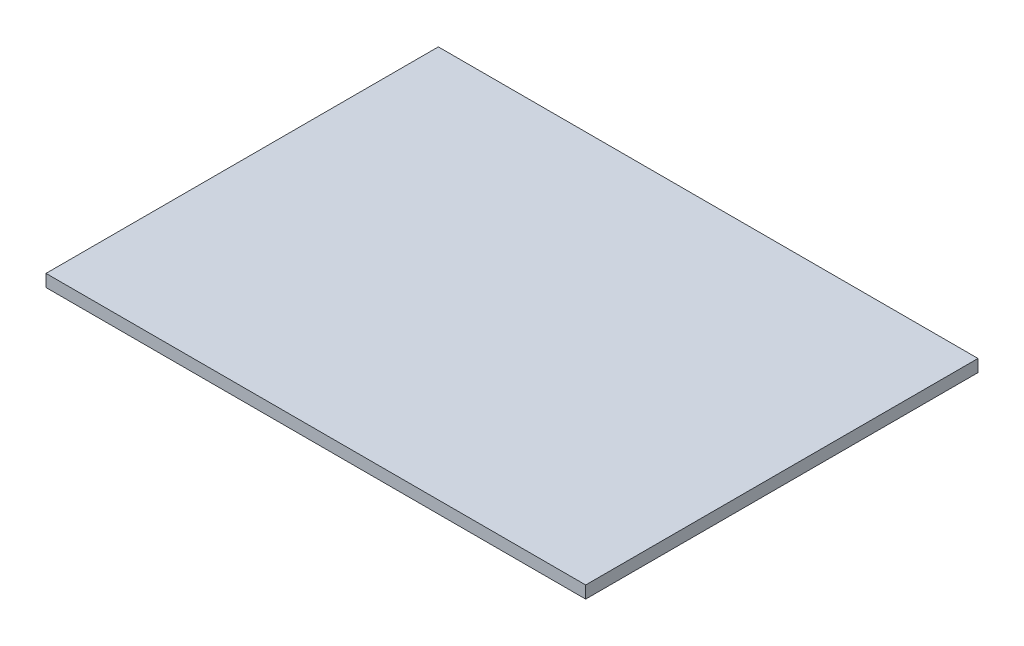
ISO-10303-21;
HEADER;
FILE_DESCRIPTION(('STEP AP214'),'2;1');
FILE_NAME('part.step','',(''),(''),'','','');
FILE_SCHEMA(('AUTOMOTIVE_DESIGN { 1 0 10303 214 1 1 1 1 }'));
ENDSEC;
DATA;
#1=APPLICATION_CONTEXT('core data for automotive mechanical design processes');
#2=APPLICATION_PROTOCOL_DEFINITION('international standard','automotive_design',2000,#1);
#3=PRODUCT_CONTEXT('',#1,'mechanical');
#4=PRODUCT('Part','Part','',(#3));
#5=PRODUCT_RELATED_PRODUCT_CATEGORY('part','',(#4));
#6=PRODUCT_DEFINITION_FORMATION('','',#4);
#7=PRODUCT_DEFINITION_CONTEXT('part definition',#1,'design');
#8=PRODUCT_DEFINITION('design','',#6,#7);
#9=PRODUCT_DEFINITION_SHAPE('','',#8);
#10=(LENGTH_UNIT() NAMED_UNIT(*) SI_UNIT(.MILLI.,.METRE.));
#11=(NAMED_UNIT(*) PLANE_ANGLE_UNIT() SI_UNIT($,.RADIAN.));
#12=(NAMED_UNIT(*) SI_UNIT($,.STERADIAN.) SOLID_ANGLE_UNIT());
#13=UNCERTAINTY_MEASURE_WITH_UNIT(LENGTH_MEASURE(1.E-05),#10,'distance_accuracy_value','');
#14=(GEOMETRIC_REPRESENTATION_CONTEXT(3) GLOBAL_UNCERTAINTY_ASSIGNED_CONTEXT((#13)) GLOBAL_UNIT_ASSIGNED_CONTEXT((#10,
#11,#12)) REPRESENTATION_CONTEXT('',''));
#15=CARTESIAN_POINT('',(0.,0.,0.));
#16=DIRECTION('',(0.,0.,1.));
#17=DIRECTION('',(1.,0.,0.));
#18=AXIS2_PLACEMENT_3D('',#15,#16,#17);
#19=CARTESIAN_POINT('',(279.4,0.,0.));
#20=DIRECTION('',(0.,0.,-1.));
#21=DIRECTION('',(-1.,0.,0.));
#22=AXIS2_PLACEMENT_3D('',#19,#20,#21);
#23=PLANE('',#22);
#24=DIRECTION('',(0.,-1.,0.));
#25=VECTOR('',#24,1.);
#26=CARTESIAN_POINT('',(0.,0.,0.));
#27=LINE('',#26,#25);
#28=CARTESIAN_POINT('',(0.,0.,0.));
#29=VERTEX_POINT('',#28);
#30=CARTESIAN_POINT('',(0.,-6.36004815257271,0.));
#31=VERTEX_POINT('',#30);
#32=EDGE_CURVE('E99',#29,#31,#27,.T.);
#33=ORIENTED_EDGE('',*,*,#32,.T.);
#34=DIRECTION('',(-1.,0.,0.));
#35=VECTOR('',#34,1.);
#36=CARTESIAN_POINT('',(279.4,-6.36004815257271,0.));
#37=LINE('',#36,#35);
#38=CARTESIAN_POINT('',(279.4,-6.36004815257271,0.));
#39=VERTEX_POINT('',#38);
#40=EDGE_CURVE('E11',#39,#31,#37,.T.);
#41=ORIENTED_EDGE('',*,*,#40,.F.);
#42=DIRECTION('',(0.,-1.,0.));
#43=VECTOR('',#42,1.);
#44=CARTESIAN_POINT('',(279.4,0.,0.));
#45=LINE('',#44,#43);
#46=CARTESIAN_POINT('',(279.4,0.,0.));
#47=VERTEX_POINT('',#46);
#48=EDGE_CURVE('E87',#47,#39,#45,.T.);
#49=ORIENTED_EDGE('',*,*,#48,.F.);
#50=DIRECTION('',(-1.,0.,0.));
#51=VECTOR('',#50,1.);
#52=CARTESIAN_POINT('',(279.4,0.,0.));
#53=LINE('',#52,#51);
#54=EDGE_CURVE('E95',#47,#29,#53,.T.);
#55=ORIENTED_EDGE('',*,*,#54,.T.);
#56=EDGE_LOOP('',(#33,#41,#49,#55));
#57=FACE_BOUND('',#56,.T.);
#58=ADVANCED_FACE('F36',(#57),#23,.F.);
#59=CARTESIAN_POINT('',(279.4,-6.36004815257271,0.));
#60=DIRECTION('',(0.,1.,0.));
#61=DIRECTION('',(0.,0.,1.));
#62=AXIS2_PLACEMENT_3D('',#59,#60,#61);
#63=PLANE('',#62);
#64=DIRECTION('',(0.,0.,-1.));
#65=VECTOR('',#64,1.);
#66=CARTESIAN_POINT('',(0.,-6.36004815257271,0.));
#67=LINE('',#66,#65);
#68=CARTESIAN_POINT('',(0.,-6.36004815257271,-203.113554370191));
#69=VERTEX_POINT('',#68);
#70=EDGE_CURVE('E91',#31,#69,#67,.T.);
#71=ORIENTED_EDGE('',*,*,#70,.T.);
#72=DIRECTION('',(-1.,0.,0.));
#73=VECTOR('',#72,1.);
#74=CARTESIAN_POINT('',(279.4,-6.36004815257271,-203.113554370191));
#75=LINE('',#74,#73);
#76=CARTESIAN_POINT('',(279.4,-6.36004815257271,-203.113554370191));
#77=VERTEX_POINT('',#76);
#78=EDGE_CURVE('E44',#77,#69,#75,.T.);
#79=ORIENTED_EDGE('',*,*,#78,.F.);
#80=DIRECTION('',(0.,0.,-1.));
#81=VECTOR('',#80,1.);
#82=CARTESIAN_POINT('',(279.4,-6.36004815257271,0.));
#83=LINE('',#82,#81);
#84=EDGE_CURVE('E82',#39,#77,#83,.T.);
#85=ORIENTED_EDGE('',*,*,#84,.F.);
#86=ORIENTED_EDGE('',*,*,#40,.T.);
#87=EDGE_LOOP('',(#71,#79,#85,#86));
#88=FACE_BOUND('',#87,.T.);
#89=ADVANCED_FACE('F90',(#88),#63,.F.);
#90=CARTESIAN_POINT('',(279.4,0.,-203.113554370191));
#91=DIRECTION('',(0.,0.,1.));
#92=DIRECTION('',(1.,0.,0.));
#93=AXIS2_PLACEMENT_3D('',#90,#91,#92);
#94=PLANE('',#93);
#95=DIRECTION('',(0.,1.,0.));
#96=VECTOR('',#95,1.);
#97=CARTESIAN_POINT('',(0.,0.,-203.113554370191));
#98=LINE('',#97,#96);
#99=CARTESIAN_POINT('',(0.,0.,-203.113554370191));
#100=VERTEX_POINT('',#99);
#101=EDGE_CURVE('E69',#69,#100,#98,.T.);
#102=ORIENTED_EDGE('',*,*,#101,.T.);
#103=DIRECTION('',(-1.,0.,0.));
#104=VECTOR('',#103,1.);
#105=CARTESIAN_POINT('',(279.4,0.,-203.113554370191));
#106=LINE('',#105,#104);
#107=CARTESIAN_POINT('',(279.4,0.,-203.113554370191));
#108=VERTEX_POINT('',#107);
#109=EDGE_CURVE('E92',#108,#100,#106,.T.);
#110=ORIENTED_EDGE('',*,*,#109,.F.);
#111=DIRECTION('',(0.,1.,0.));
#112=VECTOR('',#111,1.);
#113=CARTESIAN_POINT('',(279.4,0.,-203.113554370191));
#114=LINE('',#113,#112);
#115=EDGE_CURVE('E85',#77,#108,#114,.T.);
#116=ORIENTED_EDGE('',*,*,#115,.F.);
#117=ORIENTED_EDGE('',*,*,#78,.T.);
#118=EDGE_LOOP('',(#102,#110,#116,#117));
#119=FACE_BOUND('',#118,.T.);
#120=ADVANCED_FACE('F93',(#119),#94,.F.);
#121=CARTESIAN_POINT('',(279.4,0.,0.));
#122=DIRECTION('',(0.,-1.,0.));
#123=DIRECTION('',(0.,0.,-1.));
#124=AXIS2_PLACEMENT_3D('',#121,#122,#123);
#125=PLANE('',#124);
#126=DIRECTION('',(0.,0.,1.));
#127=VECTOR('',#126,1.);
#128=CARTESIAN_POINT('',(0.,0.,0.));
#129=LINE('',#128,#127);
#130=EDGE_CURVE('E75',#100,#29,#129,.T.);
#131=ORIENTED_EDGE('',*,*,#130,.T.);
#132=ORIENTED_EDGE('',*,*,#54,.F.);
#133=DIRECTION('',(0.,0.,1.));
#134=VECTOR('',#133,1.);
#135=CARTESIAN_POINT('',(279.4,0.,0.));
#136=LINE('',#135,#134);
#137=EDGE_CURVE('E52',#108,#47,#136,.T.);
#138=ORIENTED_EDGE('',*,*,#137,.F.);
#139=ORIENTED_EDGE('',*,*,#109,.T.);
#140=EDGE_LOOP('',(#131,#132,#138,#139));
#141=FACE_BOUND('',#140,.T.);
#142=ADVANCED_FACE('F106',(#141),#125,.F.);
#143=CARTESIAN_POINT('',(279.4,0.,0.));
#144=DIRECTION('',(1.,0.,0.));
#145=DIRECTION('',(0.,0.,-1.));
#146=AXIS2_PLACEMENT_3D('',#143,#144,#145);
#147=PLANE('',#146);
#148=ORIENTED_EDGE('',*,*,#48,.T.);
#149=ORIENTED_EDGE('',*,*,#84,.T.);
#150=ORIENTED_EDGE('',*,*,#115,.T.);
#151=ORIENTED_EDGE('',*,*,#137,.T.);
#152=EDGE_LOOP('',(#148,#149,#150,#151));
#153=FACE_BOUND('',#152,.T.);
#154=ADVANCED_FACE('F83',(#153),#147,.T.);
#155=CARTESIAN_POINT('',(0.,0.,0.));
#156=DIRECTION('',(1.,0.,0.));
#157=DIRECTION('',(0.,0.,-1.));
#158=AXIS2_PLACEMENT_3D('',#155,#156,#157);
#159=PLANE('',#158);
#160=ORIENTED_EDGE('',*,*,#32,.F.);
#161=ORIENTED_EDGE('',*,*,#130,.F.);
#162=ORIENTED_EDGE('',*,*,#101,.F.);
#163=ORIENTED_EDGE('',*,*,#70,.F.);
#164=EDGE_LOOP('',(#160,#161,#162,#163));
#165=FACE_BOUND('',#164,.T.);
#166=ADVANCED_FACE('F109',(#165),#159,.F.);
#167=CLOSED_SHELL('',(#58,#89,#120,#142,#154,#166));
#168=MANIFOLD_SOLID_BREP('B2',#167);
#169=ADVANCED_BREP_SHAPE_REPRESENTATION('',(#18,#168),#14);
#170=SHAPE_DEFINITION_REPRESENTATION(#9,#169);
ENDSEC;
END-ISO-10303-21;
